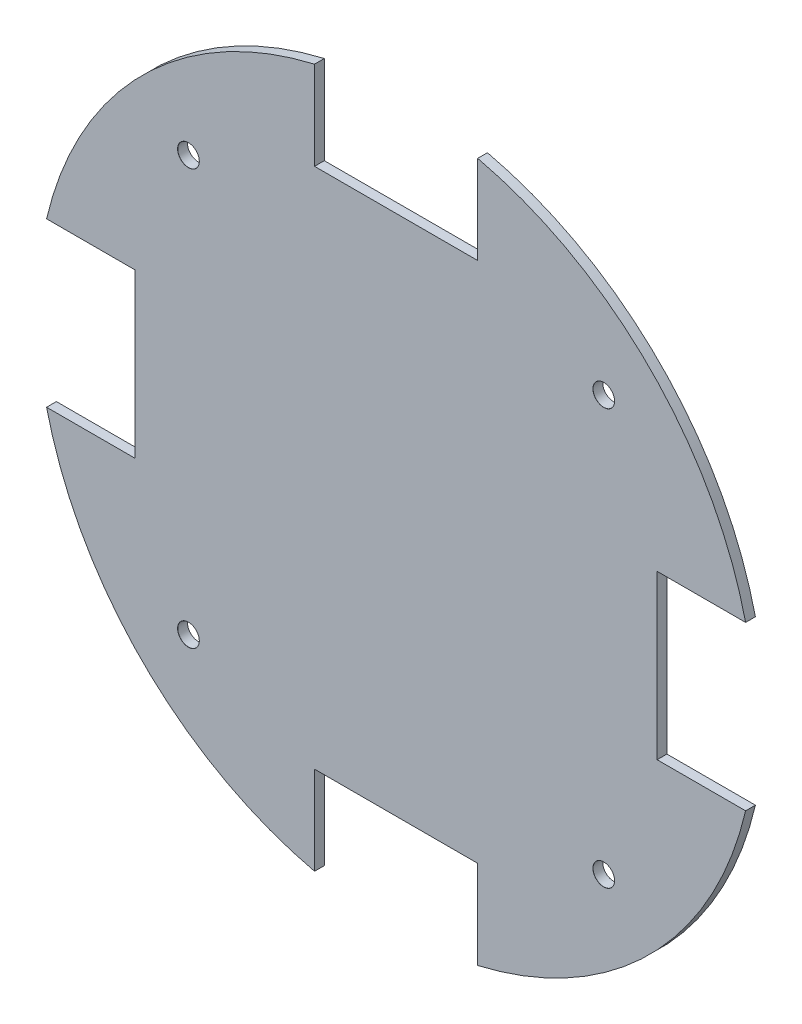
ISO-10303-21;
HEADER;
FILE_DESCRIPTION(('STEP AP214'),'2;1');
FILE_NAME('part.step','',(''),(''),'','','');
FILE_SCHEMA(('AUTOMOTIVE_DESIGN { 1 0 10303 214 1 1 1 1 }'));
ENDSEC;
DATA;
#1=APPLICATION_CONTEXT('core data for automotive mechanical design processes');
#2=APPLICATION_PROTOCOL_DEFINITION('international standard','automotive_design',2000,#1);
#3=PRODUCT_CONTEXT('',#1,'mechanical');
#4=PRODUCT('Part','Part','',(#3));
#5=PRODUCT_RELATED_PRODUCT_CATEGORY('part','',(#4));
#6=PRODUCT_DEFINITION_FORMATION('','',#4);
#7=PRODUCT_DEFINITION_CONTEXT('part definition',#1,'design');
#8=PRODUCT_DEFINITION('design','',#6,#7);
#9=PRODUCT_DEFINITION_SHAPE('','',#8);
#10=(LENGTH_UNIT() NAMED_UNIT(*) SI_UNIT(.MILLI.,.METRE.));
#11=(NAMED_UNIT(*) PLANE_ANGLE_UNIT() SI_UNIT($,.RADIAN.));
#12=(NAMED_UNIT(*) SI_UNIT($,.STERADIAN.) SOLID_ANGLE_UNIT());
#13=UNCERTAINTY_MEASURE_WITH_UNIT(LENGTH_MEASURE(1.E-05),#10,'distance_accuracy_value','');
#14=(GEOMETRIC_REPRESENTATION_CONTEXT(3) GLOBAL_UNCERTAINTY_ASSIGNED_CONTEXT((#13)) GLOBAL_UNIT_ASSIGNED_CONTEXT((#10,
#11,#12)) REPRESENTATION_CONTEXT('',''));
#15=CARTESIAN_POINT('',(0.,0.,0.));
#16=DIRECTION('',(0.,0.,1.));
#17=DIRECTION('',(1.,0.,0.));
#18=AXIS2_PLACEMENT_3D('',#15,#16,#17);
#19=CARTESIAN_POINT('',(0.,0.,3.));
#20=DIRECTION('',(0.,0.,-1.));
#21=DIRECTION('',(-1.,0.,0.));
#22=AXIS2_PLACEMENT_3D('',#19,#20,#21);
#23=CYLINDRICAL_SURFACE('',#22,110.);
#24=CARTESIAN_POINT('',(0.,0.,0.));
#25=DIRECTION('',(0.,0.,1.));
#26=DIRECTION('',(1.,0.,0.));
#27=AXIS2_PLACEMENT_3D('',#24,#25,#26);
#28=CIRCLE('',#27,110.);
#29=CARTESIAN_POINT('',(-25.,107.121426428143,0.));
#30=VERTEX_POINT('',#29);
#31=CARTESIAN_POINT('',(-107.121426428143,25.,0.));
#32=VERTEX_POINT('',#31);
#33=EDGE_CURVE('E379',#30,#32,#28,.T.);
#34=ORIENTED_EDGE('',*,*,#33,.T.);
#35=DIRECTION('',(0.,0.,-1.));
#36=VECTOR('',#35,1.);
#37=CARTESIAN_POINT('',(-107.121426428143,25.,3.));
#38=LINE('',#37,#36);
#39=CARTESIAN_POINT('',(-107.121426428143,25.,3.));
#40=VERTEX_POINT('',#39);
#41=EDGE_CURVE('E165',#32,#40,#38,.F.);
#42=ORIENTED_EDGE('',*,*,#41,.T.);
#43=CARTESIAN_POINT('',(0.,0.,3.));
#44=DIRECTION('',(0.,0.,1.));
#45=DIRECTION('',(1.,0.,0.));
#46=AXIS2_PLACEMENT_3D('',#43,#44,#45);
#47=CIRCLE('',#46,110.);
#48=CARTESIAN_POINT('',(-25.,107.121426428143,3.));
#49=VERTEX_POINT('',#48);
#50=EDGE_CURVE('E401',#49,#40,#47,.T.);
#51=ORIENTED_EDGE('',*,*,#50,.F.);
#52=DIRECTION('',(0.,0.,-1.));
#53=VECTOR('',#52,1.);
#54=CARTESIAN_POINT('',(-25.,107.121426428143,3.));
#55=LINE('',#54,#53);
#56=EDGE_CURVE('E229',#49,#30,#55,.T.);
#57=ORIENTED_EDGE('',*,*,#56,.T.);
#58=EDGE_LOOP('',(#34,#42,#51,#57));
#59=FACE_BOUND('',#58,.T.);
#60=ADVANCED_FACE('F38',(#59),#23,.T.);
#61=CARTESIAN_POINT('',(107.121426428143,25.,3.));
#62=VERTEX_POINT('',#61);
#63=CARTESIAN_POINT('',(25.,107.121426428143,3.));
#64=VERTEX_POINT('',#63);
#65=EDGE_CURVE('E336',#62,#64,#47,.T.);
#66=ORIENTED_EDGE('',*,*,#65,.F.);
#67=DIRECTION('',(0.,0.,-1.));
#68=VECTOR('',#67,1.);
#69=CARTESIAN_POINT('',(107.121426428143,25.,3.));
#70=LINE('',#69,#68);
#71=CARTESIAN_POINT('',(107.121426428143,25.,0.));
#72=VERTEX_POINT('',#71);
#73=EDGE_CURVE('E263',#62,#72,#70,.T.);
#74=ORIENTED_EDGE('',*,*,#73,.T.);
#75=CARTESIAN_POINT('',(25.,107.121426428143,0.));
#76=VERTEX_POINT('',#75);
#77=EDGE_CURVE('E335',#72,#76,#28,.T.);
#78=ORIENTED_EDGE('',*,*,#77,.T.);
#79=DIRECTION('',(0.,0.,-1.));
#80=VECTOR('',#79,1.);
#81=CARTESIAN_POINT('',(25.,107.121426428143,3.));
#82=LINE('',#81,#80);
#83=EDGE_CURVE('E219',#76,#64,#82,.F.);
#84=ORIENTED_EDGE('',*,*,#83,.T.);
#85=EDGE_LOOP('',(#66,#74,#78,#84));
#86=FACE_BOUND('',#85,.T.);
#87=ADVANCED_FACE('F387',(#86),#23,.T.);
#88=CARTESIAN_POINT('',(-107.121426428143,-25.,3.));
#89=VERTEX_POINT('',#88);
#90=CARTESIAN_POINT('',(-25.,-107.121426428143,3.));
#91=VERTEX_POINT('',#90);
#92=EDGE_CURVE('E334',#89,#91,#47,.T.);
#93=ORIENTED_EDGE('',*,*,#92,.F.);
#94=DIRECTION('',(0.,0.,-1.));
#95=VECTOR('',#94,1.);
#96=CARTESIAN_POINT('',(-107.121426428143,-25.,3.));
#97=LINE('',#96,#95);
#98=CARTESIAN_POINT('',(-107.121426428143,-25.,0.));
#99=VERTEX_POINT('',#98);
#100=EDGE_CURVE('E270',#89,#99,#97,.T.);
#101=ORIENTED_EDGE('',*,*,#100,.T.);
#102=CARTESIAN_POINT('',(-25.,-107.121426428143,0.));
#103=VERTEX_POINT('',#102);
#104=EDGE_CURVE('E340',#99,#103,#28,.T.);
#105=ORIENTED_EDGE('',*,*,#104,.T.);
#106=DIRECTION('',(0.,0.,-1.));
#107=VECTOR('',#106,1.);
#108=CARTESIAN_POINT('',(-25.,-107.121426428143,3.));
#109=LINE('',#108,#107);
#110=EDGE_CURVE('E246',#103,#91,#109,.F.);
#111=ORIENTED_EDGE('',*,*,#110,.T.);
#112=EDGE_LOOP('',(#93,#101,#105,#111));
#113=FACE_BOUND('',#112,.T.);
#114=ADVANCED_FACE('F377',(#113),#23,.T.);
#115=CARTESIAN_POINT('',(25.,-107.121426428143,0.));
#116=VERTEX_POINT('',#115);
#117=CARTESIAN_POINT('',(107.121426428143,-25.,0.));
#118=VERTEX_POINT('',#117);
#119=EDGE_CURVE('E329',#116,#118,#28,.T.);
#120=ORIENTED_EDGE('',*,*,#119,.T.);
#121=DIRECTION('',(0.,0.,-1.));
#122=VECTOR('',#121,1.);
#123=CARTESIAN_POINT('',(107.121426428143,-25.,3.));
#124=LINE('',#123,#122);
#125=CARTESIAN_POINT('',(107.121426428143,-25.,3.));
#126=VERTEX_POINT('',#125);
#127=EDGE_CURVE('E253',#118,#126,#124,.F.);
#128=ORIENTED_EDGE('',*,*,#127,.T.);
#129=CARTESIAN_POINT('',(25.,-107.121426428143,3.));
#130=VERTEX_POINT('',#129);
#131=EDGE_CURVE('E330',#130,#126,#47,.T.);
#132=ORIENTED_EDGE('',*,*,#131,.F.);
#133=DIRECTION('',(0.,0.,-1.));
#134=VECTOR('',#133,1.);
#135=CARTESIAN_POINT('',(25.,-107.121426428143,3.));
#136=LINE('',#135,#134);
#137=EDGE_CURVE('E239',#130,#116,#136,.T.);
#138=ORIENTED_EDGE('',*,*,#137,.T.);
#139=EDGE_LOOP('',(#120,#128,#132,#138));
#140=FACE_BOUND('',#139,.T.);
#141=ADVANCED_FACE('F40',(#140),#23,.T.);
#142=CARTESIAN_POINT('',(0.,0.,3.));
#143=DIRECTION('',(0.,0.,1.));
#144=DIRECTION('',(1.,0.,0.));
#145=AXIS2_PLACEMENT_3D('',#142,#143,#144);
#146=PLANE('',#145);
#147=DIRECTION('',(-1.,0.,0.));
#148=VECTOR('',#147,1.);
#149=CARTESIAN_POINT('',(0.,24.9999999999999,3.));
#150=LINE('',#149,#148);
#151=CARTESIAN_POINT('',(-80.,25.,3.));
#152=VERTEX_POINT('',#151);
#153=EDGE_CURVE('E274',#152,#40,#150,.T.);
#154=ORIENTED_EDGE('',*,*,#153,.F.);
#155=DIRECTION('',(0.,1.,0.));
#156=VECTOR('',#155,1.);
#157=CARTESIAN_POINT('',(-80.,0.,3.));
#158=LINE('',#157,#156);
#159=CARTESIAN_POINT('',(-80.,-25.,3.));
#160=VERTEX_POINT('',#159);
#161=EDGE_CURVE('E156',#160,#152,#158,.T.);
#162=ORIENTED_EDGE('',*,*,#161,.F.);
#163=DIRECTION('',(1.,0.,0.));
#164=VECTOR('',#163,1.);
#165=CARTESIAN_POINT('',(0.,-25.,3.));
#166=LINE('',#165,#164);
#167=EDGE_CURVE('E267',#89,#160,#166,.T.);
#168=ORIENTED_EDGE('',*,*,#167,.F.);
#169=ORIENTED_EDGE('',*,*,#92,.T.);
#170=DIRECTION('',(0.,-1.,0.));
#171=VECTOR('',#170,1.);
#172=CARTESIAN_POINT('',(-25.,0.,3.));
#173=LINE('',#172,#171);
#174=CARTESIAN_POINT('',(-25.,-80.,3.));
#175=VERTEX_POINT('',#174);
#176=EDGE_CURVE('E243',#175,#91,#173,.T.);
#177=ORIENTED_EDGE('',*,*,#176,.F.);
#178=DIRECTION('',(-1.,0.,0.));
#179=VECTOR('',#178,1.);
#180=CARTESIAN_POINT('',(0.,-80.,3.));
#181=LINE('',#180,#179);
#182=CARTESIAN_POINT('',(25.,-80.,3.));
#183=VERTEX_POINT('',#182);
#184=EDGE_CURVE('E233',#183,#175,#181,.T.);
#185=ORIENTED_EDGE('',*,*,#184,.F.);
#186=DIRECTION('',(0.,1.,0.));
#187=VECTOR('',#186,1.);
#188=CARTESIAN_POINT('',(25.,0.,3.));
#189=LINE('',#188,#187);
#190=EDGE_CURVE('E236',#130,#183,#189,.T.);
#191=ORIENTED_EDGE('',*,*,#190,.F.);
#192=ORIENTED_EDGE('',*,*,#131,.T.);
#193=DIRECTION('',(1.,0.,0.));
#194=VECTOR('',#193,1.);
#195=CARTESIAN_POINT('',(0.,-25.,3.));
#196=LINE('',#195,#194);
#197=CARTESIAN_POINT('',(80.,-25.,3.));
#198=VERTEX_POINT('',#197);
#199=EDGE_CURVE('E250',#198,#126,#196,.T.);
#200=ORIENTED_EDGE('',*,*,#199,.F.);
#201=DIRECTION('',(0.,-1.,0.));
#202=VECTOR('',#201,1.);
#203=CARTESIAN_POINT('',(80.,0.,3.));
#204=LINE('',#203,#202);
#205=CARTESIAN_POINT('',(80.,25.,3.));
#206=VERTEX_POINT('',#205);
#207=EDGE_CURVE('E257',#206,#198,#204,.T.);
#208=ORIENTED_EDGE('',*,*,#207,.F.);
#209=DIRECTION('',(-1.,0.,0.));
#210=VECTOR('',#209,1.);
#211=CARTESIAN_POINT('',(0.,25.,3.));
#212=LINE('',#211,#210);
#213=EDGE_CURVE('E260',#62,#206,#212,.T.);
#214=ORIENTED_EDGE('',*,*,#213,.F.);
#215=ORIENTED_EDGE('',*,*,#65,.T.);
#216=DIRECTION('',(0.,1.,0.));
#217=VECTOR('',#216,1.);
#218=CARTESIAN_POINT('',(25.,0.,3.));
#219=LINE('',#218,#217);
#220=CARTESIAN_POINT('',(25.,80.,3.));
#221=VERTEX_POINT('',#220);
#222=EDGE_CURVE('E160',#221,#64,#219,.T.);
#223=ORIENTED_EDGE('',*,*,#222,.F.);
#224=DIRECTION('',(1.,0.,0.));
#225=VECTOR('',#224,1.);
#226=CARTESIAN_POINT('',(0.,80.,3.));
#227=LINE('',#226,#225);
#228=CARTESIAN_POINT('',(-25.,80.,3.));
#229=VERTEX_POINT('',#228);
#230=EDGE_CURVE('E223',#229,#221,#227,.T.);
#231=ORIENTED_EDGE('',*,*,#230,.F.);
#232=DIRECTION('',(0.,-1.,0.));
#233=VECTOR('',#232,1.);
#234=CARTESIAN_POINT('',(-25.,0.,3.));
#235=LINE('',#234,#233);
#236=EDGE_CURVE('E226',#49,#229,#235,.T.);
#237=ORIENTED_EDGE('',*,*,#236,.F.);
#238=ORIENTED_EDGE('',*,*,#50,.T.);
#239=EDGE_LOOP('',(#154,#162,#168,#169,#177,#185,#191,#192,#200,#208,#214,#215,#223,#231,#237,#238));
#240=FACE_BOUND('',#239,.T.);
#241=CARTESIAN_POINT('',(-63.6396103067896,63.6396103067889,3.));
#242=DIRECTION('',(0.,0.,1.));
#243=DIRECTION('',(1.,0.,0.));
#244=AXIS2_PLACEMENT_3D('',#241,#242,#243);
#245=CIRCLE('',#244,3.325);
#246=CARTESIAN_POINT('',(-60.3146103067896,63.6396103067889,3.));
#247=VERTEX_POINT('',#246);
#248=EDGE_CURVE('E281',#247,#247,#245,.T.);
#249=ORIENTED_EDGE('',*,*,#248,.F.);
#250=EDGE_LOOP('',(#249));
#251=FACE_BOUND('',#250,.T.);
#252=CARTESIAN_POINT('',(63.6396103067891,63.6396103067894,3.));
#253=DIRECTION('',(0.,0.,1.));
#254=DIRECTION('',(1.,0.,0.));
#255=AXIS2_PLACEMENT_3D('',#252,#253,#254);
#256=CIRCLE('',#255,3.32499999999999);
#257=CARTESIAN_POINT('',(66.9646103067891,63.6396103067894,3.));
#258=VERTEX_POINT('',#257);
#259=EDGE_CURVE('E293',#258,#258,#256,.T.);
#260=ORIENTED_EDGE('',*,*,#259,.F.);
#261=EDGE_LOOP('',(#260));
#262=FACE_BOUND('',#261,.T.);
#263=CARTESIAN_POINT('',(-63.6396103067891,-63.6396103067894,3.));
#264=DIRECTION('',(0.,0.,1.));
#265=DIRECTION('',(1.,0.,0.));
#266=AXIS2_PLACEMENT_3D('',#263,#264,#265);
#267=CIRCLE('',#266,3.325);
#268=CARTESIAN_POINT('',(-60.3146103067891,-63.6396103067894,3.));
#269=VERTEX_POINT('',#268);
#270=EDGE_CURVE('E305',#269,#269,#267,.T.);
#271=ORIENTED_EDGE('',*,*,#270,.F.);
#272=EDGE_LOOP('',(#271));
#273=FACE_BOUND('',#272,.T.);
#274=CARTESIAN_POINT('',(63.6396103067896,-63.6396103067889,3.));
#275=DIRECTION('',(0.,0.,1.));
#276=DIRECTION('',(1.,0.,0.));
#277=AXIS2_PLACEMENT_3D('',#274,#275,#276);
#278=CIRCLE('',#277,3.32499999999999);
#279=CARTESIAN_POINT('',(66.9646103067896,-63.6396103067889,3.));
#280=VERTEX_POINT('',#279);
#281=EDGE_CURVE('E317',#280,#280,#278,.T.);
#282=ORIENTED_EDGE('',*,*,#281,.F.);
#283=EDGE_LOOP('',(#282));
#284=FACE_BOUND('',#283,.T.);
#285=ADVANCED_FACE('F365',(#240,#251,#262,#273,#284),#146,.T.);
#286=CARTESIAN_POINT('',(0.,0.,0.));
#287=DIRECTION('',(0.,0.,1.));
#288=DIRECTION('',(1.,0.,0.));
#289=AXIS2_PLACEMENT_3D('',#286,#287,#288);
#290=PLANE('',#289);
#291=CARTESIAN_POINT('',(-63.6396103067896,63.6396103067889,0.));
#292=DIRECTION('',(0.,0.,1.));
#293=DIRECTION('',(1.,0.,0.));
#294=AXIS2_PLACEMENT_3D('',#291,#292,#293);
#295=CIRCLE('',#294,3.3);
#296=CARTESIAN_POINT('',(-60.3396103067896,63.6396103067889,0.));
#297=VERTEX_POINT('',#296);
#298=EDGE_CURVE('E289',#297,#297,#295,.T.);
#299=ORIENTED_EDGE('',*,*,#298,.T.);
#300=EDGE_LOOP('',(#299));
#301=FACE_BOUND('',#300,.T.);
#302=CARTESIAN_POINT('',(63.6396103067891,63.6396103067894,0.));
#303=DIRECTION('',(0.,0.,1.));
#304=DIRECTION('',(1.,0.,0.));
#305=AXIS2_PLACEMENT_3D('',#302,#303,#304);
#306=CIRCLE('',#305,3.3);
#307=CARTESIAN_POINT('',(66.9396103067891,63.6396103067894,0.));
#308=VERTEX_POINT('',#307);
#309=EDGE_CURVE('E301',#308,#308,#306,.T.);
#310=ORIENTED_EDGE('',*,*,#309,.T.);
#311=EDGE_LOOP('',(#310));
#312=FACE_BOUND('',#311,.T.);
#313=CARTESIAN_POINT('',(-63.6396103067891,-63.6396103067894,0.));
#314=DIRECTION('',(0.,0.,1.));
#315=DIRECTION('',(1.,0.,0.));
#316=AXIS2_PLACEMENT_3D('',#313,#314,#315);
#317=CIRCLE('',#316,3.3);
#318=CARTESIAN_POINT('',(-60.3396103067891,-63.6396103067894,0.));
#319=VERTEX_POINT('',#318);
#320=EDGE_CURVE('E313',#319,#319,#317,.T.);
#321=ORIENTED_EDGE('',*,*,#320,.T.);
#322=EDGE_LOOP('',(#321));
#323=FACE_BOUND('',#322,.T.);
#324=CARTESIAN_POINT('',(63.6396103067896,-63.6396103067889,0.));
#325=DIRECTION('',(0.,0.,1.));
#326=DIRECTION('',(1.,0.,0.));
#327=AXIS2_PLACEMENT_3D('',#324,#325,#326);
#328=CIRCLE('',#327,3.3);
#329=CARTESIAN_POINT('',(66.9396103067896,-63.6396103067889,0.));
#330=VERTEX_POINT('',#329);
#331=EDGE_CURVE('E325',#330,#330,#328,.T.);
#332=ORIENTED_EDGE('',*,*,#331,.T.);
#333=EDGE_LOOP('',(#332));
#334=FACE_BOUND('',#333,.T.);
#335=DIRECTION('',(0.,-1.,0.));
#336=VECTOR('',#335,1.);
#337=CARTESIAN_POINT('',(-80.,25.,0.));
#338=LINE('',#337,#336);
#339=CARTESIAN_POINT('',(-80.,25.,0.));
#340=VERTEX_POINT('',#339);
#341=CARTESIAN_POINT('',(-80.,-25.,0.));
#342=VERTEX_POINT('',#341);
#343=EDGE_CURVE('E54',#340,#342,#338,.T.);
#344=ORIENTED_EDGE('',*,*,#343,.F.);
#345=DIRECTION('',(-1.,0.,0.));
#346=VECTOR('',#345,1.);
#347=CARTESIAN_POINT('',(0.,24.9999999999999,0.));
#348=LINE('',#347,#346);
#349=EDGE_CURVE('E11',#340,#32,#348,.T.);
#350=ORIENTED_EDGE('',*,*,#349,.T.);
#351=ORIENTED_EDGE('',*,*,#33,.F.);
#352=DIRECTION('',(0.,1.,0.));
#353=VECTOR('',#352,1.);
#354=CARTESIAN_POINT('',(-25.,110.,0.));
#355=LINE('',#354,#353);
#356=CARTESIAN_POINT('',(-25.,80.,0.));
#357=VERTEX_POINT('',#356);
#358=EDGE_CURVE('E205',#357,#30,#355,.T.);
#359=ORIENTED_EDGE('',*,*,#358,.F.);
#360=DIRECTION('',(-1.,0.,0.));
#361=VECTOR('',#360,1.);
#362=CARTESIAN_POINT('',(-25.,80.,0.));
#363=LINE('',#362,#361);
#364=CARTESIAN_POINT('',(25.,80.,0.));
#365=VERTEX_POINT('',#364);
#366=EDGE_CURVE('E208',#365,#357,#363,.T.);
#367=ORIENTED_EDGE('',*,*,#366,.F.);
#368=DIRECTION('',(0.,1.,0.));
#369=VECTOR('',#368,1.);
#370=CARTESIAN_POINT('',(25.,0.,0.));
#371=LINE('',#370,#369);
#372=EDGE_CURVE('E341',#365,#76,#371,.T.);
#373=ORIENTED_EDGE('',*,*,#372,.T.);
#374=ORIENTED_EDGE('',*,*,#77,.F.);
#375=DIRECTION('',(1.,0.,0.));
#376=VECTOR('',#375,1.);
#377=CARTESIAN_POINT('',(110.,25.,0.));
#378=LINE('',#377,#376);
#379=CARTESIAN_POINT('',(80.,25.,0.));
#380=VERTEX_POINT('',#379);
#381=EDGE_CURVE('E188',#380,#72,#378,.T.);
#382=ORIENTED_EDGE('',*,*,#381,.F.);
#383=DIRECTION('',(0.,1.,0.));
#384=VECTOR('',#383,1.);
#385=CARTESIAN_POINT('',(80.,25.,0.));
#386=LINE('',#385,#384);
#387=CARTESIAN_POINT('',(80.,-25.,0.));
#388=VERTEX_POINT('',#387);
#389=EDGE_CURVE('E184',#388,#380,#386,.T.);
#390=ORIENTED_EDGE('',*,*,#389,.F.);
#391=DIRECTION('',(1.,0.,0.));
#392=VECTOR('',#391,1.);
#393=CARTESIAN_POINT('',(0.,-25.,0.));
#394=LINE('',#393,#392);
#395=EDGE_CURVE('E47',#388,#118,#394,.T.);
#396=ORIENTED_EDGE('',*,*,#395,.T.);
#397=ORIENTED_EDGE('',*,*,#119,.F.);
#398=DIRECTION('',(0.,-1.,0.));
#399=VECTOR('',#398,1.);
#400=CARTESIAN_POINT('',(25.,-110.,0.));
#401=LINE('',#400,#399);
#402=CARTESIAN_POINT('',(25.,-80.,0.));
#403=VERTEX_POINT('',#402);
#404=EDGE_CURVE('E197',#403,#116,#401,.T.);
#405=ORIENTED_EDGE('',*,*,#404,.F.);
#406=DIRECTION('',(1.,0.,0.));
#407=VECTOR('',#406,1.);
#408=CARTESIAN_POINT('',(-25.,-80.,0.));
#409=LINE('',#408,#407);
#410=CARTESIAN_POINT('',(-25.,-80.,0.));
#411=VERTEX_POINT('',#410);
#412=EDGE_CURVE('E194',#411,#403,#409,.T.);
#413=ORIENTED_EDGE('',*,*,#412,.F.);
#414=DIRECTION('',(0.,-1.,0.));
#415=VECTOR('',#414,1.);
#416=CARTESIAN_POINT('',(-25.,0.,0.));
#417=LINE('',#416,#415);
#418=EDGE_CURVE('E345',#411,#103,#417,.T.);
#419=ORIENTED_EDGE('',*,*,#418,.T.);
#420=ORIENTED_EDGE('',*,*,#104,.F.);
#421=DIRECTION('',(-1.,0.,0.));
#422=VECTOR('',#421,1.);
#423=CARTESIAN_POINT('',(-80.,-25.,0.));
#424=LINE('',#423,#422);
#425=EDGE_CURVE('E172',#342,#99,#424,.T.);
#426=ORIENTED_EDGE('',*,*,#425,.F.);
#427=EDGE_LOOP('',(#344,#350,#351,#359,#367,#373,#374,#382,#390,#396,#397,#405,#413,#419,#420,#426));
#428=FACE_BOUND('',#427,.T.);
#429=ADVANCED_FACE('F170',(#301,#312,#323,#334,#428),#290,.F.);
#430=CARTESIAN_POINT('',(63.6396103067896,-63.6396103067889,3.));
#431=DIRECTION('',(0.,0.,1.));
#432=DIRECTION('',(1.,0.,0.));
#433=AXIS2_PLACEMENT_3D('',#430,#431,#432);
#434=CYLINDRICAL_SURFACE('',#433,3.3);
#435=ORIENTED_EDGE('',*,*,#331,.F.);
#436=EDGE_LOOP('',(#435));
#437=FACE_BOUND('',#436,.T.);
#438=CARTESIAN_POINT('',(63.6396103067896,-63.6396103067889,2.975));
#439=DIRECTION('',(0.,0.,1.));
#440=DIRECTION('',(1.,0.,0.));
#441=AXIS2_PLACEMENT_3D('',#438,#439,#440);
#442=CIRCLE('',#441,3.3);
#443=CARTESIAN_POINT('',(66.9396103067896,-63.6396103067889,2.975));
#444=VERTEX_POINT('',#443);
#445=EDGE_CURVE('E321',#444,#444,#442,.T.);
#446=ORIENTED_EDGE('',*,*,#445,.T.);
#447=EDGE_LOOP('',(#446));
#448=FACE_BOUND('',#447,.T.);
#449=ADVANCED_FACE('F511',(#437,#448),#434,.F.);
#450=CARTESIAN_POINT('',(63.6396103067896,-63.6396103067889,3.));
#451=DIRECTION('',(0.,0.,1.));
#452=DIRECTION('',(1.,0.,0.));
#453=AXIS2_PLACEMENT_3D('',#450,#451,#452);
#454=CONICAL_SURFACE('',#453,3.32499999999999,0.785398163397422);
#455=ORIENTED_EDGE('',*,*,#445,.F.);
#456=EDGE_LOOP('',(#455));
#457=FACE_BOUND('',#456,.T.);
#458=ORIENTED_EDGE('',*,*,#281,.T.);
#459=EDGE_LOOP('',(#458));
#460=FACE_BOUND('',#459,.T.);
#461=ADVANCED_FACE('F501',(#457,#460),#454,.F.);
#462=CARTESIAN_POINT('',(-63.6396103067891,-63.6396103067894,3.));
#463=DIRECTION('',(0.,0.,1.));
#464=DIRECTION('',(1.,0.,0.));
#465=AXIS2_PLACEMENT_3D('',#462,#463,#464);
#466=CYLINDRICAL_SURFACE('',#465,3.3);
#467=ORIENTED_EDGE('',*,*,#320,.F.);
#468=EDGE_LOOP('',(#467));
#469=FACE_BOUND('',#468,.T.);
#470=CARTESIAN_POINT('',(-63.6396103067891,-63.6396103067894,2.975));
#471=DIRECTION('',(0.,0.,1.));
#472=DIRECTION('',(1.,0.,0.));
#473=AXIS2_PLACEMENT_3D('',#470,#471,#472);
#474=CIRCLE('',#473,3.3);
#475=CARTESIAN_POINT('',(-60.3396103067891,-63.6396103067894,2.975));
#476=VERTEX_POINT('',#475);
#477=EDGE_CURVE('E309',#476,#476,#474,.T.);
#478=ORIENTED_EDGE('',*,*,#477,.T.);
#479=EDGE_LOOP('',(#478));
#480=FACE_BOUND('',#479,.T.);
#481=ADVANCED_FACE('F491',(#469,#480),#466,.F.);
#482=CARTESIAN_POINT('',(-63.6396103067891,-63.6396103067894,3.));
#483=DIRECTION('',(0.,0.,1.));
#484=DIRECTION('',(1.,0.,0.));
#485=AXIS2_PLACEMENT_3D('',#482,#483,#484);
#486=CONICAL_SURFACE('',#485,3.325,0.785398163397561);
#487=ORIENTED_EDGE('',*,*,#477,.F.);
#488=EDGE_LOOP('',(#487));
#489=FACE_BOUND('',#488,.T.);
#490=ORIENTED_EDGE('',*,*,#270,.T.);
#491=EDGE_LOOP('',(#490));
#492=FACE_BOUND('',#491,.T.);
#493=ADVANCED_FACE('F481',(#489,#492),#486,.F.);
#494=CARTESIAN_POINT('',(63.6396103067891,63.6396103067894,3.));
#495=DIRECTION('',(0.,0.,1.));
#496=DIRECTION('',(1.,0.,0.));
#497=AXIS2_PLACEMENT_3D('',#494,#495,#496);
#498=CYLINDRICAL_SURFACE('',#497,3.3);
#499=ORIENTED_EDGE('',*,*,#309,.F.);
#500=EDGE_LOOP('',(#499));
#501=FACE_BOUND('',#500,.T.);
#502=CARTESIAN_POINT('',(63.6396103067891,63.6396103067894,2.975));
#503=DIRECTION('',(0.,0.,1.));
#504=DIRECTION('',(1.,0.,0.));
#505=AXIS2_PLACEMENT_3D('',#502,#503,#504);
#506=CIRCLE('',#505,3.3);
#507=CARTESIAN_POINT('',(66.9396103067891,63.6396103067894,2.975));
#508=VERTEX_POINT('',#507);
#509=EDGE_CURVE('E297',#508,#508,#506,.T.);
#510=ORIENTED_EDGE('',*,*,#509,.T.);
#511=EDGE_LOOP('',(#510));
#512=FACE_BOUND('',#511,.T.);
#513=ADVANCED_FACE('F471',(#501,#512),#498,.F.);
#514=CARTESIAN_POINT('',(63.6396103067891,63.6396103067894,3.));
#515=DIRECTION('',(0.,0.,1.));
#516=DIRECTION('',(1.,0.,0.));
#517=AXIS2_PLACEMENT_3D('',#514,#515,#516);
#518=CONICAL_SURFACE('',#517,3.32499999999999,0.785398163397422);
#519=ORIENTED_EDGE('',*,*,#509,.F.);
#520=EDGE_LOOP('',(#519));
#521=FACE_BOUND('',#520,.T.);
#522=ORIENTED_EDGE('',*,*,#259,.T.);
#523=EDGE_LOOP('',(#522));
#524=FACE_BOUND('',#523,.T.);
#525=ADVANCED_FACE('F461',(#521,#524),#518,.F.);
#526=CARTESIAN_POINT('',(-63.6396103067896,63.6396103067889,3.));
#527=DIRECTION('',(0.,0.,1.));
#528=DIRECTION('',(1.,0.,0.));
#529=AXIS2_PLACEMENT_3D('',#526,#527,#528);
#530=CYLINDRICAL_SURFACE('',#529,3.3);
#531=ORIENTED_EDGE('',*,*,#298,.F.);
#532=EDGE_LOOP('',(#531));
#533=FACE_BOUND('',#532,.T.);
#534=CARTESIAN_POINT('',(-63.6396103067896,63.6396103067889,2.975));
#535=DIRECTION('',(0.,0.,1.));
#536=DIRECTION('',(1.,0.,0.));
#537=AXIS2_PLACEMENT_3D('',#534,#535,#536);
#538=CIRCLE('',#537,3.3);
#539=CARTESIAN_POINT('',(-60.3396103067896,63.6396103067889,2.975));
#540=VERTEX_POINT('',#539);
#541=EDGE_CURVE('E285',#540,#540,#538,.T.);
#542=ORIENTED_EDGE('',*,*,#541,.T.);
#543=EDGE_LOOP('',(#542));
#544=FACE_BOUND('',#543,.T.);
#545=ADVANCED_FACE('F450',(#533,#544),#530,.F.);
#546=CARTESIAN_POINT('',(-63.6396103067896,63.6396103067889,3.));
#547=DIRECTION('',(0.,0.,1.));
#548=DIRECTION('',(1.,0.,0.));
#549=AXIS2_PLACEMENT_3D('',#546,#547,#548);
#550=CONICAL_SURFACE('',#549,3.325,0.785398163397561);
#551=ORIENTED_EDGE('',*,*,#541,.F.);
#552=EDGE_LOOP('',(#551));
#553=FACE_BOUND('',#552,.T.);
#554=ORIENTED_EDGE('',*,*,#248,.T.);
#555=EDGE_LOOP('',(#554));
#556=FACE_BOUND('',#555,.T.);
#557=ADVANCED_FACE('F444',(#553,#556),#550,.F.);
#558=CARTESIAN_POINT('',(-25.,110.,10.));
#559=DIRECTION('',(-1.,0.,0.));
#560=DIRECTION('',(0.,-1.,0.));
#561=AXIS2_PLACEMENT_3D('',#558,#559,#560);
#562=PLANE('',#561);
#563=ORIENTED_EDGE('',*,*,#236,.T.);
#564=DIRECTION('',(0.,0.,-1.));
#565=VECTOR('',#564,1.);
#566=CARTESIAN_POINT('',(-25.,80.,10.));
#567=LINE('',#566,#565);
#568=EDGE_CURVE('E198',#229,#357,#567,.T.);
#569=ORIENTED_EDGE('',*,*,#568,.T.);
#570=ORIENTED_EDGE('',*,*,#358,.T.);
#571=ORIENTED_EDGE('',*,*,#56,.F.);
#572=EDGE_LOOP('',(#563,#569,#570,#571));
#573=FACE_BOUND('',#572,.T.);
#574=ADVANCED_FACE('F449',(#573),#562,.F.);
#575=CARTESIAN_POINT('',(25.,110.,10.));
#576=DIRECTION('',(1.,0.,0.));
#577=DIRECTION('',(0.,1.,0.));
#578=AXIS2_PLACEMENT_3D('',#575,#576,#577);
#579=PLANE('',#578);
#580=ORIENTED_EDGE('',*,*,#372,.F.);
#581=DIRECTION('',(0.,0.,-1.));
#582=VECTOR('',#581,1.);
#583=CARTESIAN_POINT('',(25.,80.,10.));
#584=LINE('',#583,#582);
#585=EDGE_CURVE('E212',#221,#365,#584,.T.);
#586=ORIENTED_EDGE('',*,*,#585,.F.);
#587=ORIENTED_EDGE('',*,*,#222,.T.);
#588=ORIENTED_EDGE('',*,*,#83,.F.);
#589=EDGE_LOOP('',(#580,#586,#587,#588));
#590=FACE_BOUND('',#589,.T.);
#591=ADVANCED_FACE('F394',(#590),#579,.F.);
#592=CARTESIAN_POINT('',(-25.,80.,10.));
#593=DIRECTION('',(0.,-1.,0.));
#594=DIRECTION('',(1.,0.,0.));
#595=AXIS2_PLACEMENT_3D('',#592,#593,#594);
#596=PLANE('',#595);
#597=ORIENTED_EDGE('',*,*,#230,.T.);
#598=ORIENTED_EDGE('',*,*,#585,.T.);
#599=ORIENTED_EDGE('',*,*,#366,.T.);
#600=ORIENTED_EDGE('',*,*,#568,.F.);
#601=EDGE_LOOP('',(#597,#598,#599,#600));
#602=FACE_BOUND('',#601,.T.);
#603=ADVANCED_FACE('F555',(#602),#596,.F.);
#604=CARTESIAN_POINT('',(-25.,-110.,10.));
#605=DIRECTION('',(-1.,0.,0.));
#606=DIRECTION('',(0.,0.,1.));
#607=AXIS2_PLACEMENT_3D('',#604,#605,#606);
#608=PLANE('',#607);
#609=ORIENTED_EDGE('',*,*,#418,.F.);
#610=DIRECTION('',(0.,0.,-1.));
#611=VECTOR('',#610,1.);
#612=CARTESIAN_POINT('',(-25.,-80.,10.));
#613=LINE('',#612,#611);
#614=EDGE_CURVE('E62',#175,#411,#613,.T.);
#615=ORIENTED_EDGE('',*,*,#614,.F.);
#616=ORIENTED_EDGE('',*,*,#176,.T.);
#617=ORIENTED_EDGE('',*,*,#110,.F.);
#618=EDGE_LOOP('',(#609,#615,#616,#617));
#619=FACE_BOUND('',#618,.T.);
#620=ADVANCED_FACE('F372',(#619),#608,.F.);
#621=CARTESIAN_POINT('',(25.,-110.,10.));
#622=DIRECTION('',(1.,0.,0.));
#623=DIRECTION('',(0.,1.,0.));
#624=AXIS2_PLACEMENT_3D('',#621,#622,#623);
#625=PLANE('',#624);
#626=ORIENTED_EDGE('',*,*,#190,.T.);
#627=DIRECTION('',(0.,0.,-1.));
#628=VECTOR('',#627,1.);
#629=CARTESIAN_POINT('',(25.,-80.,10.));
#630=LINE('',#629,#628);
#631=EDGE_CURVE('E189',#183,#403,#630,.T.);
#632=ORIENTED_EDGE('',*,*,#631,.T.);
#633=ORIENTED_EDGE('',*,*,#404,.T.);
#634=ORIENTED_EDGE('',*,*,#137,.F.);
#635=EDGE_LOOP('',(#626,#632,#633,#634));
#636=FACE_BOUND('',#635,.T.);
#637=ADVANCED_FACE('F361',(#636),#625,.F.);
#638=CARTESIAN_POINT('',(-25.,-80.,10.));
#639=DIRECTION('',(0.,1.,0.));
#640=DIRECTION('',(0.,0.,1.));
#641=AXIS2_PLACEMENT_3D('',#638,#639,#640);
#642=PLANE('',#641);
#643=ORIENTED_EDGE('',*,*,#184,.T.);
#644=ORIENTED_EDGE('',*,*,#614,.T.);
#645=ORIENTED_EDGE('',*,*,#412,.T.);
#646=ORIENTED_EDGE('',*,*,#631,.F.);
#647=EDGE_LOOP('',(#643,#644,#645,#646));
#648=FACE_BOUND('',#647,.T.);
#649=ADVANCED_FACE('F370',(#648),#642,.F.);
#650=CARTESIAN_POINT('',(110.,25.,10.));
#651=DIRECTION('',(0.,1.,0.));
#652=DIRECTION('',(0.,0.,1.));
#653=AXIS2_PLACEMENT_3D('',#650,#651,#652);
#654=PLANE('',#653);
#655=ORIENTED_EDGE('',*,*,#213,.T.);
#656=DIRECTION('',(0.,0.,-1.));
#657=VECTOR('',#656,1.);
#658=CARTESIAN_POINT('',(80.,25.,10.));
#659=LINE('',#658,#657);
#660=EDGE_CURVE('E174',#206,#380,#659,.T.);
#661=ORIENTED_EDGE('',*,*,#660,.T.);
#662=ORIENTED_EDGE('',*,*,#381,.T.);
#663=ORIENTED_EDGE('',*,*,#73,.F.);
#664=EDGE_LOOP('',(#655,#661,#662,#663));
#665=FACE_BOUND('',#664,.T.);
#666=ADVANCED_FACE('F589',(#665),#654,.F.);
#667=CARTESIAN_POINT('',(110.,-25.,10.));
#668=DIRECTION('',(0.,-1.,0.));
#669=DIRECTION('',(0.,0.,-1.));
#670=AXIS2_PLACEMENT_3D('',#667,#668,#669);
#671=PLANE('',#670);
#672=ORIENTED_EDGE('',*,*,#395,.F.);
#673=DIRECTION('',(0.,0.,-1.));
#674=VECTOR('',#673,1.);
#675=CARTESIAN_POINT('',(80.,-25.,10.));
#676=LINE('',#675,#674);
#677=EDGE_CURVE('E179',#198,#388,#676,.T.);
#678=ORIENTED_EDGE('',*,*,#677,.F.);
#679=ORIENTED_EDGE('',*,*,#199,.T.);
#680=ORIENTED_EDGE('',*,*,#127,.F.);
#681=EDGE_LOOP('',(#672,#678,#679,#680));
#682=FACE_BOUND('',#681,.T.);
#683=ADVANCED_FACE('F598',(#682),#671,.F.);
#684=CARTESIAN_POINT('',(80.,25.,10.));
#685=DIRECTION('',(-1.,0.,0.));
#686=DIRECTION('',(0.,-1.,0.));
#687=AXIS2_PLACEMENT_3D('',#684,#685,#686);
#688=PLANE('',#687);
#689=ORIENTED_EDGE('',*,*,#207,.T.);
#690=ORIENTED_EDGE('',*,*,#677,.T.);
#691=ORIENTED_EDGE('',*,*,#389,.T.);
#692=ORIENTED_EDGE('',*,*,#660,.F.);
#693=EDGE_LOOP('',(#689,#690,#691,#692));
#694=FACE_BOUND('',#693,.T.);
#695=ADVANCED_FACE('F416',(#694),#688,.F.);
#696=CARTESIAN_POINT('',(-80.,25.,10.));
#697=DIRECTION('',(0.,1.,0.));
#698=DIRECTION('',(-1.,0.,0.));
#699=AXIS2_PLACEMENT_3D('',#696,#697,#698);
#700=PLANE('',#699);
#701=ORIENTED_EDGE('',*,*,#349,.F.);
#702=DIRECTION('',(0.,0.,-1.));
#703=VECTOR('',#702,1.);
#704=CARTESIAN_POINT('',(-80.,25.,10.));
#705=LINE('',#704,#703);
#706=EDGE_CURVE('E152',#152,#340,#705,.T.);
#707=ORIENTED_EDGE('',*,*,#706,.F.);
#708=ORIENTED_EDGE('',*,*,#153,.T.);
#709=ORIENTED_EDGE('',*,*,#41,.F.);
#710=EDGE_LOOP('',(#701,#707,#708,#709));
#711=FACE_BOUND('',#710,.T.);
#712=ADVANCED_FACE('F163',(#711),#700,.F.);
#713=CARTESIAN_POINT('',(-80.,-25.,10.));
#714=DIRECTION('',(0.,-1.,0.));
#715=DIRECTION('',(0.,0.,-1.));
#716=AXIS2_PLACEMENT_3D('',#713,#714,#715);
#717=PLANE('',#716);
#718=ORIENTED_EDGE('',*,*,#167,.T.);
#719=DIRECTION('',(0.,0.,-1.));
#720=VECTOR('',#719,1.);
#721=CARTESIAN_POINT('',(-80.,-25.,10.));
#722=LINE('',#721,#720);
#723=EDGE_CURVE('E161',#160,#342,#722,.T.);
#724=ORIENTED_EDGE('',*,*,#723,.T.);
#725=ORIENTED_EDGE('',*,*,#425,.T.);
#726=ORIENTED_EDGE('',*,*,#100,.F.);
#727=EDGE_LOOP('',(#718,#724,#725,#726));
#728=FACE_BOUND('',#727,.T.);
#729=ADVANCED_FACE('F408',(#728),#717,.F.);
#730=CARTESIAN_POINT('',(-80.,25.,10.));
#731=DIRECTION('',(1.,0.,0.));
#732=DIRECTION('',(0.,1.,0.));
#733=AXIS2_PLACEMENT_3D('',#730,#731,#732);
#734=PLANE('',#733);
#735=ORIENTED_EDGE('',*,*,#161,.T.);
#736=ORIENTED_EDGE('',*,*,#706,.T.);
#737=ORIENTED_EDGE('',*,*,#343,.T.);
#738=ORIENTED_EDGE('',*,*,#723,.F.);
#739=EDGE_LOOP('',(#735,#736,#737,#738));
#740=FACE_BOUND('',#739,.T.);
#741=ADVANCED_FACE('F154',(#740),#734,.F.);
#742=CLOSED_SHELL('',(#60,#87,#114,#141,#285,#429,#449,#461,#481,#493,#513,#525,#545,#557,#574,
#591,#603,#620,#637,#649,#666,#683,#695,#712,#729,#741));
#743=MANIFOLD_SOLID_BREP('B2',#742);
#744=ADVANCED_BREP_SHAPE_REPRESENTATION('',(#18,#743),#14);
#745=SHAPE_DEFINITION_REPRESENTATION(#9,#744);
ENDSEC;
END-ISO-10303-21;
